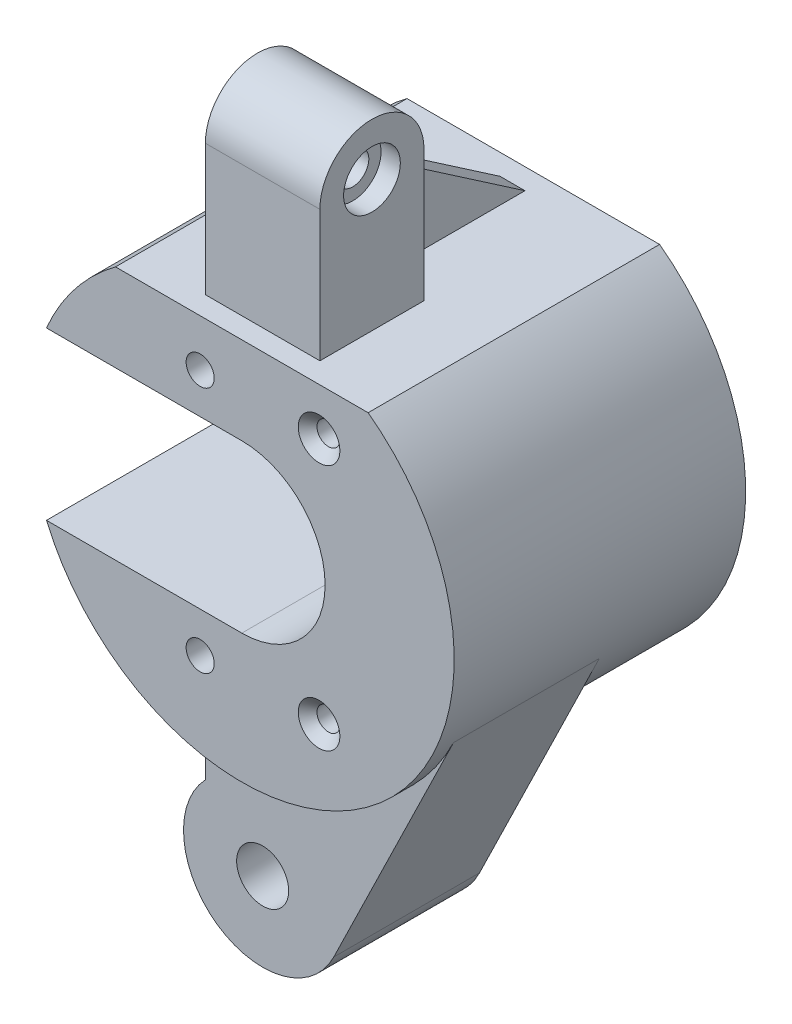
ISO-10303-21;
HEADER;
FILE_DESCRIPTION(('STEP AP214'),'2;1');
FILE_NAME('part.step','',(''),(''),'','','');
FILE_SCHEMA(('AUTOMOTIVE_DESIGN { 1 0 10303 214 1 1 1 1 }'));
ENDSEC;
DATA;
#1=APPLICATION_CONTEXT('core data for automotive mechanical design processes');
#2=APPLICATION_PROTOCOL_DEFINITION('international standard','automotive_design',2000,#1);
#3=PRODUCT_CONTEXT('',#1,'mechanical');
#4=PRODUCT('Part','Part','',(#3));
#5=PRODUCT_RELATED_PRODUCT_CATEGORY('part','',(#4));
#6=PRODUCT_DEFINITION_FORMATION('','',#4);
#7=PRODUCT_DEFINITION_CONTEXT('part definition',#1,'design');
#8=PRODUCT_DEFINITION('design','',#6,#7);
#9=PRODUCT_DEFINITION_SHAPE('','',#8);
#10=(LENGTH_UNIT() NAMED_UNIT(*) SI_UNIT(.MILLI.,.METRE.));
#11=(NAMED_UNIT(*) PLANE_ANGLE_UNIT() SI_UNIT($,.RADIAN.));
#12=(NAMED_UNIT(*) SI_UNIT($,.STERADIAN.) SOLID_ANGLE_UNIT());
#13=UNCERTAINTY_MEASURE_WITH_UNIT(LENGTH_MEASURE(1.E-05),#10,'distance_accuracy_value','');
#14=(GEOMETRIC_REPRESENTATION_CONTEXT(3) GLOBAL_UNCERTAINTY_ASSIGNED_CONTEXT((#13)) GLOBAL_UNIT_ASSIGNED_CONTEXT((#10,
#11,#12)) REPRESENTATION_CONTEXT('',''));
#15=CARTESIAN_POINT('',(0.,0.,0.));
#16=DIRECTION('',(0.,0.,1.));
#17=DIRECTION('',(1.,0.,0.));
#18=AXIS2_PLACEMENT_3D('',#15,#16,#17);
#19=CARTESIAN_POINT('',(0.,0.,-140.));
#20=DIRECTION('',(0.,0.,1.));
#21=DIRECTION('',(1.,0.,0.));
#22=AXIS2_PLACEMENT_3D('',#19,#20,#21);
#23=CYLINDRICAL_SURFACE('',#22,102.);
#24=CARTESIAN_POINT('',(0.,0.,-80.));
#25=DIRECTION('',(0.,0.,-1.));
#26=DIRECTION('',(-1.,0.,0.));
#27=AXIS2_PLACEMENT_3D('',#24,#25,#26);
#28=CIRCLE('',#27,102.);
#29=CARTESIAN_POINT('',(91.6777380623054,-44.7123287671233,-80.));
#30=VERTEX_POINT('',#29);
#31=CARTESIAN_POINT('',(-27.5,-98.2229606558466,-80.));
#32=VERTEX_POINT('',#31);
#33=EDGE_CURVE('E312',#30,#32,#28,.T.);
#34=ORIENTED_EDGE('',*,*,#33,.T.);
#35=DIRECTION('',(0.,0.,1.));
#36=VECTOR('',#35,1.);
#37=CARTESIAN_POINT('',(-27.5,-98.2229606558466,-80.));
#38=LINE('',#37,#36);
#39=CARTESIAN_POINT('',(-27.5,-98.2229606558466,-10.));
#40=VERTEX_POINT('',#39);
#41=EDGE_CURVE('E332',#32,#40,#38,.T.);
#42=ORIENTED_EDGE('',*,*,#41,.T.);
#43=CARTESIAN_POINT('',(0.,0.,-10.));
#44=DIRECTION('',(0.,0.,-1.));
#45=DIRECTION('',(-1.,0.,0.));
#46=AXIS2_PLACEMENT_3D('',#43,#44,#45);
#47=CIRCLE('',#46,102.);
#48=CARTESIAN_POINT('',(91.6777380623054,-44.7123287671233,-10.));
#49=VERTEX_POINT('',#48);
#50=EDGE_CURVE('E313',#49,#40,#47,.T.);
#51=ORIENTED_EDGE('',*,*,#50,.F.);
#52=DIRECTION('',(0.,0.,1.));
#53=VECTOR('',#52,1.);
#54=CARTESIAN_POINT('',(91.6777380623054,-44.7123287671233,-80.));
#55=LINE('',#54,#53);
#56=EDGE_CURVE('E341',#30,#49,#55,.T.);
#57=ORIENTED_EDGE('',*,*,#56,.F.);
#58=EDGE_LOOP('',(#34,#42,#51,#57));
#59=FACE_BOUND('',#58,.T.);
#60=CARTESIAN_POINT('',(0.,0.,-120.));
#61=DIRECTION('',(0.,0.,-1.));
#62=DIRECTION('',(1.,0.,0.));
#63=AXIS2_PLACEMENT_3D('',#60,#61,#62);
#64=CIRCLE('',#63,102.);
#65=CARTESIAN_POINT('',(-88.9044430835715,-50.,-120.));
#66=VERTEX_POINT('',#65);
#67=CARTESIAN_POINT('',(-93.8296328459192,-40.,-120.));
#68=VERTEX_POINT('',#67);
#69=EDGE_CURVE('E227',#66,#68,#64,.T.);
#70=ORIENTED_EDGE('',*,*,#69,.F.);
#71=DIRECTION('',(0.,0.,-1.));
#72=VECTOR('',#71,1.);
#73=CARTESIAN_POINT('',(-88.9044430835715,-50.,-120.));
#74=LINE('',#73,#72);
#75=CARTESIAN_POINT('',(-88.9044430835715,-50.,-140.));
#76=VERTEX_POINT('',#75);
#77=EDGE_CURVE('E208',#66,#76,#74,.T.);
#78=ORIENTED_EDGE('',*,*,#77,.T.);
#79=CARTESIAN_POINT('',(0.,0.,-140.));
#80=DIRECTION('',(0.,0.,1.));
#81=DIRECTION('',(1.,0.,0.));
#82=AXIS2_PLACEMENT_3D('',#79,#80,#81);
#83=CIRCLE('',#82,102.);
#84=CARTESIAN_POINT('',(60.6630035524124,82.,-140.));
#85=VERTEX_POINT('',#84);
#86=EDGE_CURVE('E431',#76,#85,#83,.T.);
#87=ORIENTED_EDGE('',*,*,#86,.T.);
#88=DIRECTION('',(0.,0.,1.));
#89=VECTOR('',#88,1.);
#90=CARTESIAN_POINT('',(60.6630035524124,82.,-140.));
#91=LINE('',#90,#89);
#92=CARTESIAN_POINT('',(60.6630035524124,82.,0.));
#93=VERTEX_POINT('',#92);
#94=EDGE_CURVE('E462',#85,#93,#91,.T.);
#95=ORIENTED_EDGE('',*,*,#94,.T.);
#96=CARTESIAN_POINT('',(0.,0.,0.));
#97=DIRECTION('',(0.,0.,1.));
#98=DIRECTION('',(1.,0.,0.));
#99=AXIS2_PLACEMENT_3D('',#96,#97,#98);
#100=CIRCLE('',#99,102.);
#101=CARTESIAN_POINT('',(-93.8296328459192,-40.,0.));
#102=VERTEX_POINT('',#101);
#103=EDGE_CURVE('E452',#102,#93,#100,.T.);
#104=ORIENTED_EDGE('',*,*,#103,.F.);
#105=DIRECTION('',(0.,0.,1.));
#106=VECTOR('',#105,1.);
#107=CARTESIAN_POINT('',(-93.8296328459192,-40.,-140.));
#108=LINE('',#107,#106);
#109=EDGE_CURVE('E470',#68,#102,#108,.T.);
#110=ORIENTED_EDGE('',*,*,#109,.F.);
#111=EDGE_LOOP('',(#70,#78,#87,#95,#104,#110));
#112=FACE_BOUND('',#111,.T.);
#113=ADVANCED_FACE('F44',(#59,#112),#23,.T.);
#114=CARTESIAN_POINT('',(0.,-40.,-140.));
#115=DIRECTION('',(0.,1.,0.));
#116=DIRECTION('',(0.,0.,1.));
#117=AXIS2_PLACEMENT_3D('',#114,#115,#116);
#118=PLANE('',#117);
#119=DIRECTION('',(0.,0.,1.));
#120=VECTOR('',#119,1.);
#121=CARTESIAN_POINT('',(0.,-40.,-140.));
#122=LINE('',#121,#120);
#123=CARTESIAN_POINT('',(0.,-40.,-120.));
#124=VERTEX_POINT('',#123);
#125=CARTESIAN_POINT('',(0.,-40.,0.));
#126=VERTEX_POINT('',#125);
#127=EDGE_CURVE('E467',#124,#126,#122,.T.);
#128=ORIENTED_EDGE('',*,*,#127,.F.);
#129=DIRECTION('',(-1.,0.,0.));
#130=VECTOR('',#129,1.);
#131=CARTESIAN_POINT('',(0.,-40.,-120.));
#132=LINE('',#131,#130);
#133=EDGE_CURVE('E249',#124,#68,#132,.T.);
#134=ORIENTED_EDGE('',*,*,#133,.T.);
#135=ORIENTED_EDGE('',*,*,#109,.T.);
#136=DIRECTION('',(-1.,0.,0.));
#137=VECTOR('',#136,1.);
#138=CARTESIAN_POINT('',(0.,-40.,0.));
#139=LINE('',#138,#137);
#140=EDGE_CURVE('E453',#126,#102,#139,.T.);
#141=ORIENTED_EDGE('',*,*,#140,.F.);
#142=EDGE_LOOP('',(#128,#134,#135,#141));
#143=FACE_BOUND('',#142,.T.);
#144=ADVANCED_FACE('F538',(#143),#118,.T.);
#145=CARTESIAN_POINT('',(0.,0.,-140.));
#146=DIRECTION('',(0.,0.,1.));
#147=DIRECTION('',(1.,0.,0.));
#148=AXIS2_PLACEMENT_3D('',#145,#146,#147);
#149=CYLINDRICAL_SURFACE('',#148,40.);
#150=DIRECTION('',(0.,0.,1.));
#151=VECTOR('',#150,1.);
#152=CARTESIAN_POINT('',(0.,40.,-140.));
#153=LINE('',#152,#151);
#154=CARTESIAN_POINT('',(0.,40.,-120.));
#155=VERTEX_POINT('',#154);
#156=CARTESIAN_POINT('',(0.,40.,0.));
#157=VERTEX_POINT('',#156);
#158=EDGE_CURVE('E471',#155,#157,#153,.T.);
#159=ORIENTED_EDGE('',*,*,#158,.F.);
#160=CARTESIAN_POINT('',(0.,0.,-120.));
#161=DIRECTION('',(0.,0.,-1.));
#162=DIRECTION('',(-1.,0.,0.));
#163=AXIS2_PLACEMENT_3D('',#160,#161,#162);
#164=CIRCLE('',#163,40.);
#165=EDGE_CURVE('E238',#155,#124,#164,.T.);
#166=ORIENTED_EDGE('',*,*,#165,.T.);
#167=ORIENTED_EDGE('',*,*,#127,.T.);
#168=CARTESIAN_POINT('',(0.,0.,0.));
#169=DIRECTION('',(0.,0.,-1.));
#170=DIRECTION('',(1.,0.,0.));
#171=AXIS2_PLACEMENT_3D('',#168,#169,#170);
#172=CIRCLE('',#171,40.);
#173=EDGE_CURVE('E449',#157,#126,#172,.T.);
#174=ORIENTED_EDGE('',*,*,#173,.F.);
#175=EDGE_LOOP('',(#159,#166,#167,#174));
#176=FACE_BOUND('',#175,.T.);
#177=ADVANCED_FACE('F544',(#176),#149,.F.);
#178=CARTESIAN_POINT('',(0.,40.,-140.));
#179=DIRECTION('',(0.,-1.,0.));
#180=DIRECTION('',(0.,0.,-1.));
#181=AXIS2_PLACEMENT_3D('',#178,#179,#180);
#182=PLANE('',#181);
#183=DIRECTION('',(0.,0.,1.));
#184=VECTOR('',#183,1.);
#185=CARTESIAN_POINT('',(-93.8296328459192,40.,-140.));
#186=LINE('',#185,#184);
#187=CARTESIAN_POINT('',(-93.8296328459192,40.,-120.));
#188=VERTEX_POINT('',#187);
#189=CARTESIAN_POINT('',(-93.8296328459192,40.,0.));
#190=VERTEX_POINT('',#189);
#191=EDGE_CURVE('E438',#188,#190,#186,.T.);
#192=ORIENTED_EDGE('',*,*,#191,.F.);
#193=DIRECTION('',(1.,0.,0.));
#194=VECTOR('',#193,1.);
#195=CARTESIAN_POINT('',(0.,40.,-120.));
#196=LINE('',#195,#194);
#197=EDGE_CURVE('E11',#188,#155,#196,.T.);
#198=ORIENTED_EDGE('',*,*,#197,.T.);
#199=ORIENTED_EDGE('',*,*,#158,.T.);
#200=DIRECTION('',(1.,0.,0.));
#201=VECTOR('',#200,1.);
#202=CARTESIAN_POINT('',(0.,40.,0.));
#203=LINE('',#202,#201);
#204=EDGE_CURVE('E444',#190,#157,#203,.T.);
#205=ORIENTED_EDGE('',*,*,#204,.F.);
#206=EDGE_LOOP('',(#192,#198,#199,#205));
#207=FACE_BOUND('',#206,.T.);
#208=ADVANCED_FACE('F554',(#207),#182,.T.);
#209=CARTESIAN_POINT('',(0.,0.,-140.));
#210=DIRECTION('',(0.,0.,1.));
#211=DIRECTION('',(1.,0.,0.));
#212=AXIS2_PLACEMENT_3D('',#209,#210,#211);
#213=PLANE('',#212);
#214=CARTESIAN_POINT('',(37.0943484963242,-59.3633667309499,-140.));
#215=DIRECTION('',(0.,0.,1.));
#216=DIRECTION('',(1.,0.,0.));
#217=AXIS2_PLACEMENT_3D('',#214,#215,#216);
#218=CIRCLE('',#217,5.49999999999998);
#219=CARTESIAN_POINT('',(42.5943484963242,-59.3633667309499,-140.));
#220=VERTEX_POINT('',#219);
#221=EDGE_CURVE('E305',#220,#220,#218,.T.);
#222=ORIENTED_EDGE('',*,*,#221,.T.);
#223=EDGE_LOOP('',(#222));
#224=FACE_BOUND('',#223,.T.);
#225=CARTESIAN_POINT('',(37.0943484963242,59.3633667309499,-140.));
#226=DIRECTION('',(0.,0.,1.));
#227=DIRECTION('',(1.,0.,0.));
#228=AXIS2_PLACEMENT_3D('',#225,#226,#227);
#229=CIRCLE('',#228,5.49999999999998);
#230=CARTESIAN_POINT('',(42.5943484963242,59.3633667309499,-140.));
#231=VERTEX_POINT('',#230);
#232=EDGE_CURVE('E287',#231,#231,#229,.T.);
#233=ORIENTED_EDGE('',*,*,#232,.T.);
#234=EDGE_LOOP('',(#233));
#235=FACE_BOUND('',#234,.T.);
#236=DIRECTION('',(-1.,0.,0.));
#237=VECTOR('',#236,1.);
#238=CARTESIAN_POINT('',(0.,-50.,-140.));
#239=LINE('',#238,#237);
#240=CARTESIAN_POINT('',(0.,-50.,-140.));
#241=VERTEX_POINT('',#240);
#242=EDGE_CURVE('E223',#241,#76,#239,.T.);
#243=ORIENTED_EDGE('',*,*,#242,.F.);
#244=CARTESIAN_POINT('',(0.,0.,-140.));
#245=DIRECTION('',(0.,0.,-1.));
#246=DIRECTION('',(-1.,0.,0.));
#247=AXIS2_PLACEMENT_3D('',#244,#245,#246);
#248=CIRCLE('',#247,50.);
#249=CARTESIAN_POINT('',(0.,50.,-140.));
#250=VERTEX_POINT('',#249);
#251=EDGE_CURVE('E204',#250,#241,#248,.T.);
#252=ORIENTED_EDGE('',*,*,#251,.F.);
#253=DIRECTION('',(1.,0.,0.));
#254=VECTOR('',#253,1.);
#255=CARTESIAN_POINT('',(0.,50.,-140.));
#256=LINE('',#255,#254);
#257=CARTESIAN_POINT('',(-88.9044430835715,50.,-140.));
#258=VERTEX_POINT('',#257);
#259=EDGE_CURVE('E63',#258,#250,#256,.T.);
#260=ORIENTED_EDGE('',*,*,#259,.F.);
#261=CARTESIAN_POINT('',(0.,0.,-140.));
#262=DIRECTION('',(0.,0.,1.));
#263=DIRECTION('',(1.,0.,0.));
#264=AXIS2_PLACEMENT_3D('',#261,#262,#263);
#265=CIRCLE('',#264,102.);
#266=CARTESIAN_POINT('',(-60.6630035524124,82.,-140.));
#267=VERTEX_POINT('',#266);
#268=EDGE_CURVE('E430',#267,#258,#265,.T.);
#269=ORIENTED_EDGE('',*,*,#268,.F.);
#270=DIRECTION('',(-1.,0.,0.));
#271=VECTOR('',#270,1.);
#272=CARTESIAN_POINT('',(-60.6630035524124,82.,-140.));
#273=LINE('',#272,#271);
#274=EDGE_CURVE('E434',#85,#267,#273,.T.);
#275=ORIENTED_EDGE('',*,*,#274,.F.);
#276=ORIENTED_EDGE('',*,*,#86,.F.);
#277=EDGE_LOOP('',(#243,#252,#260,#269,#275,#276));
#278=FACE_BOUND('',#277,.T.);
#279=ADVANCED_FACE('F488',(#224,#235,#278),#213,.F.);
#280=CARTESIAN_POINT('',(-27.5,7.66965626340746,-9.99999999999999));
#281=DIRECTION('',(-1.,0.,0.));
#282=DIRECTION('',(0.,0.,1.));
#283=AXIS2_PLACEMENT_3D('',#280,#281,#282);
#284=PLANE('',#283);
#285=CARTESIAN_POINT('',(-27.5,145.,-35.));
#286=DIRECTION('',(-1.,0.,0.));
#287=DIRECTION('',(0.,0.,1.));
#288=AXIS2_PLACEMENT_3D('',#285,#286,#287);
#289=CIRCLE('',#288,7.74999999999998);
#290=CARTESIAN_POINT('',(-27.5,145.,-27.25));
#291=VERTEX_POINT('',#290);
#292=EDGE_CURVE('E264',#291,#291,#289,.T.);
#293=ORIENTED_EDGE('',*,*,#292,.F.);
#294=EDGE_LOOP('',(#293));
#295=FACE_BOUND('',#294,.T.);
#296=DIRECTION('',(0.,1.,0.));
#297=VECTOR('',#296,1.);
#298=CARTESIAN_POINT('',(-27.5,7.66965626340746,-9.99999999999999));
#299=LINE('',#298,#297);
#300=CARTESIAN_POINT('',(-27.5,82.,-10.));
#301=VERTEX_POINT('',#300);
#302=CARTESIAN_POINT('',(-27.5,145.,-9.99999999999999));
#303=VERTEX_POINT('',#302);
#304=EDGE_CURVE('E398',#301,#303,#299,.T.);
#305=ORIENTED_EDGE('',*,*,#304,.T.);
#306=CARTESIAN_POINT('',(-27.5,145.,-35.));
#307=DIRECTION('',(-1.,0.,0.));
#308=DIRECTION('',(0.,0.,1.));
#309=AXIS2_PLACEMENT_3D('',#306,#307,#308);
#310=CIRCLE('',#309,25.);
#311=CARTESIAN_POINT('',(-27.5,145.,-60.));
#312=VERTEX_POINT('',#311);
#313=EDGE_CURVE('E382',#303,#312,#310,.T.);
#314=ORIENTED_EDGE('',*,*,#313,.T.);
#315=DIRECTION('',(0.,1.,0.));
#316=VECTOR('',#315,1.);
#317=CARTESIAN_POINT('',(-27.5,7.66965626340746,-60.));
#318=LINE('',#317,#316);
#319=CARTESIAN_POINT('',(-27.5,82.,-60.));
#320=VERTEX_POINT('',#319);
#321=EDGE_CURVE('E402',#320,#312,#318,.T.);
#322=ORIENTED_EDGE('',*,*,#321,.F.);
#323=DIRECTION('',(0.,0.,-1.));
#324=VECTOR('',#323,1.);
#325=CARTESIAN_POINT('',(-27.5,82.,-9.99999999999999));
#326=LINE('',#325,#324);
#327=EDGE_CURVE('E408',#301,#320,#326,.T.);
#328=ORIENTED_EDGE('',*,*,#327,.F.);
#329=EDGE_LOOP('',(#305,#314,#322,#328));
#330=FACE_BOUND('',#329,.T.);
#331=ADVANCED_FACE('F482',(#295,#330),#284,.T.);
#332=CARTESIAN_POINT('',(27.5,7.66965626340746,-9.99999999999999));
#333=DIRECTION('',(1.,0.,0.));
#334=DIRECTION('',(0.,0.,-1.));
#335=AXIS2_PLACEMENT_3D('',#332,#333,#334);
#336=PLANE('',#335);
#337=CARTESIAN_POINT('',(27.5,145.,-35.));
#338=DIRECTION('',(1.,0.,0.));
#339=DIRECTION('',(0.,0.,-1.));
#340=AXIS2_PLACEMENT_3D('',#337,#338,#339);
#341=CIRCLE('',#340,13.625);
#342=CARTESIAN_POINT('',(27.5,145.,-48.625));
#343=VERTEX_POINT('',#342);
#344=EDGE_CURVE('E251',#343,#343,#341,.T.);
#345=ORIENTED_EDGE('',*,*,#344,.F.);
#346=EDGE_LOOP('',(#345));
#347=FACE_BOUND('',#346,.T.);
#348=CARTESIAN_POINT('',(27.5,145.,-35.));
#349=DIRECTION('',(1.,0.,0.));
#350=DIRECTION('',(0.,0.,-1.));
#351=AXIS2_PLACEMENT_3D('',#348,#349,#350);
#352=CIRCLE('',#351,25.);
#353=CARTESIAN_POINT('',(27.5,145.,-60.));
#354=VERTEX_POINT('',#353);
#355=CARTESIAN_POINT('',(27.5,145.,-9.99999999999999));
#356=VERTEX_POINT('',#355);
#357=EDGE_CURVE('E392',#354,#356,#352,.T.);
#358=ORIENTED_EDGE('',*,*,#357,.T.);
#359=DIRECTION('',(0.,1.,0.));
#360=VECTOR('',#359,1.);
#361=CARTESIAN_POINT('',(27.5,7.66965626340746,-9.99999999999999));
#362=LINE('',#361,#360);
#363=CARTESIAN_POINT('',(27.5,82.,-9.99999999999999));
#364=VERTEX_POINT('',#363);
#365=EDGE_CURVE('E417',#364,#356,#362,.T.);
#366=ORIENTED_EDGE('',*,*,#365,.F.);
#367=DIRECTION('',(0.,0.,1.));
#368=VECTOR('',#367,1.);
#369=CARTESIAN_POINT('',(27.5,82.,-9.99999999999999));
#370=LINE('',#369,#368);
#371=CARTESIAN_POINT('',(27.5,82.,-60.));
#372=VERTEX_POINT('',#371);
#373=EDGE_CURVE('E400',#372,#364,#370,.T.);
#374=ORIENTED_EDGE('',*,*,#373,.F.);
#375=DIRECTION('',(0.,1.,0.));
#376=VECTOR('',#375,1.);
#377=CARTESIAN_POINT('',(27.5,7.66965626340746,-60.));
#378=LINE('',#377,#376);
#379=EDGE_CURVE('E411',#372,#354,#378,.T.);
#380=ORIENTED_EDGE('',*,*,#379,.T.);
#381=EDGE_LOOP('',(#358,#366,#374,#380));
#382=FACE_BOUND('',#381,.T.);
#383=ADVANCED_FACE('F490',(#347,#382),#336,.T.);
#384=CARTESIAN_POINT('',(27.5,7.66965626340746,-9.99999999999999));
#385=DIRECTION('',(0.,0.,1.));
#386=DIRECTION('',(1.,0.,0.));
#387=AXIS2_PLACEMENT_3D('',#384,#385,#386);
#388=PLANE('',#387);
#389=DIRECTION('',(-1.,0.,0.));
#390=VECTOR('',#389,1.);
#391=CARTESIAN_POINT('',(102.,145.,-9.99999999999999));
#392=LINE('',#391,#390);
#393=EDGE_CURVE('E53',#356,#303,#392,.T.);
#394=ORIENTED_EDGE('',*,*,#393,.T.);
#395=ORIENTED_EDGE('',*,*,#304,.F.);
#396=DIRECTION('',(-1.,0.,0.));
#397=VECTOR('',#396,1.);
#398=CARTESIAN_POINT('',(27.5,82.,-9.99999999999999));
#399=LINE('',#398,#397);
#400=EDGE_CURVE('E410',#364,#301,#399,.T.);
#401=ORIENTED_EDGE('',*,*,#400,.F.);
#402=ORIENTED_EDGE('',*,*,#365,.T.);
#403=EDGE_LOOP('',(#394,#395,#401,#402));
#404=FACE_BOUND('',#403,.T.);
#405=ADVANCED_FACE('F497',(#404),#388,.T.);
#406=CARTESIAN_POINT('',(0.,0.,-140.));
#407=DIRECTION('',(0.,0.,1.));
#408=DIRECTION('',(1.,0.,0.));
#409=AXIS2_PLACEMENT_3D('',#406,#407,#408);
#410=CYLINDRICAL_SURFACE('',#409,102.);
#411=CARTESIAN_POINT('',(-88.9044430835715,50.,-120.));
#412=VERTEX_POINT('',#411);
#413=EDGE_CURVE('E217',#188,#412,#64,.T.);
#414=ORIENTED_EDGE('',*,*,#413,.F.);
#415=ORIENTED_EDGE('',*,*,#191,.T.);
#416=CARTESIAN_POINT('',(0.,0.,0.));
#417=DIRECTION('',(0.,0.,1.));
#418=DIRECTION('',(1.,0.,0.));
#419=AXIS2_PLACEMENT_3D('',#416,#417,#418);
#420=CIRCLE('',#419,102.);
#421=CARTESIAN_POINT('',(-60.6630035524124,82.,0.));
#422=VERTEX_POINT('',#421);
#423=EDGE_CURVE('E426',#422,#190,#420,.T.);
#424=ORIENTED_EDGE('',*,*,#423,.F.);
#425=DIRECTION('',(0.,0.,1.));
#426=VECTOR('',#425,1.);
#427=CARTESIAN_POINT('',(-60.6630035524124,82.,-140.));
#428=LINE('',#427,#426);
#429=EDGE_CURVE('E387',#267,#422,#428,.T.);
#430=ORIENTED_EDGE('',*,*,#429,.F.);
#431=ORIENTED_EDGE('',*,*,#268,.T.);
#432=DIRECTION('',(0.,0.,-1.));
#433=VECTOR('',#432,1.);
#434=CARTESIAN_POINT('',(-88.9044430835715,50.,-120.));
#435=LINE('',#434,#433);
#436=EDGE_CURVE('E243',#412,#258,#435,.T.);
#437=ORIENTED_EDGE('',*,*,#436,.F.);
#438=EDGE_LOOP('',(#414,#415,#424,#430,#431,#437));
#439=FACE_BOUND('',#438,.T.);
#440=ADVANCED_FACE('F50',(#439),#410,.T.);
#441=CARTESIAN_POINT('',(-60.6630035524124,82.,-140.));
#442=DIRECTION('',(0.,1.,0.));
#443=DIRECTION('',(0.,0.,1.));
#444=AXIS2_PLACEMENT_3D('',#441,#442,#443);
#445=PLANE('',#444);
#446=ORIENTED_EDGE('',*,*,#400,.T.);
#447=ORIENTED_EDGE('',*,*,#327,.T.);
#448=DIRECTION('',(1.,0.,0.));
#449=VECTOR('',#448,1.);
#450=CARTESIAN_POINT('',(27.5,82.,-60.));
#451=LINE('',#450,#449);
#452=CARTESIAN_POINT('',(-6.,82.,-60.));
#453=VERTEX_POINT('',#452);
#454=EDGE_CURVE('E405',#320,#453,#451,.T.);
#455=ORIENTED_EDGE('',*,*,#454,.T.);
#456=DIRECTION('',(0.,0.,-1.));
#457=VECTOR('',#456,1.);
#458=CARTESIAN_POINT('',(-6.,82.,-140.));
#459=LINE('',#458,#457);
#460=CARTESIAN_POINT('',(-6.,82.,-130.));
#461=VERTEX_POINT('',#460);
#462=EDGE_CURVE('E365',#453,#461,#459,.T.);
#463=ORIENTED_EDGE('',*,*,#462,.T.);
#464=DIRECTION('',(1.,0.,0.));
#465=VECTOR('',#464,1.);
#466=CARTESIAN_POINT('',(-60.6630035524124,82.,-130.));
#467=LINE('',#466,#465);
#468=CARTESIAN_POINT('',(6.,82.,-130.));
#469=VERTEX_POINT('',#468);
#470=EDGE_CURVE('E379',#469,#461,#467,.F.);
#471=ORIENTED_EDGE('',*,*,#470,.F.);
#472=DIRECTION('',(0.,0.,-1.));
#473=VECTOR('',#472,1.);
#474=CARTESIAN_POINT('',(6.00000000000001,82.,-140.));
#475=LINE('',#474,#473);
#476=CARTESIAN_POINT('',(6.,82.,-60.));
#477=VERTEX_POINT('',#476);
#478=EDGE_CURVE('E375',#477,#469,#475,.T.);
#479=ORIENTED_EDGE('',*,*,#478,.F.);
#480=EDGE_CURVE('E397',#477,#372,#451,.T.);
#481=ORIENTED_EDGE('',*,*,#480,.T.);
#482=ORIENTED_EDGE('',*,*,#373,.T.);
#483=EDGE_LOOP('',(#446,#447,#455,#463,#471,#479,#481,#482));
#484=FACE_BOUND('',#483,.T.);
#485=ORIENTED_EDGE('',*,*,#429,.T.);
#486=DIRECTION('',(-1.,0.,0.));
#487=VECTOR('',#486,1.);
#488=CARTESIAN_POINT('',(-60.6630035524124,82.,0.));
#489=LINE('',#488,#487);
#490=EDGE_CURVE('E435',#93,#422,#489,.T.);
#491=ORIENTED_EDGE('',*,*,#490,.F.);
#492=ORIENTED_EDGE('',*,*,#94,.F.);
#493=ORIENTED_EDGE('',*,*,#274,.T.);
#494=EDGE_LOOP('',(#485,#491,#492,#493));
#495=FACE_BOUND('',#494,.T.);
#496=ADVANCED_FACE('F512',(#484,#495),#445,.T.);
#497=CARTESIAN_POINT('',(0.,0.,0.));
#498=DIRECTION('',(0.,0.,1.));
#499=DIRECTION('',(1.,0.,0.));
#500=AXIS2_PLACEMENT_3D('',#497,#498,#499);
#501=PLANE('',#500);
#502=CARTESIAN_POINT('',(-20.,-59.3633667309499,0.));
#503=DIRECTION('',(0.,0.,1.));
#504=DIRECTION('',(1.,0.,0.));
#505=AXIS2_PLACEMENT_3D('',#502,#503,#504);
#506=CIRCLE('',#505,6.74999999999999);
#507=CARTESIAN_POINT('',(-13.25,-59.3633667309499,0.));
#508=VERTEX_POINT('',#507);
#509=EDGE_CURVE('E266',#508,#508,#506,.T.);
#510=ORIENTED_EDGE('',*,*,#509,.F.);
#511=EDGE_LOOP('',(#510));
#512=FACE_BOUND('',#511,.T.);
#513=CARTESIAN_POINT('',(-20.,59.3633667309499,0.));
#514=DIRECTION('',(0.,0.,1.));
#515=DIRECTION('',(1.,0.,0.));
#516=AXIS2_PLACEMENT_3D('',#513,#514,#515);
#517=CIRCLE('',#516,6.74999999999999);
#518=CARTESIAN_POINT('',(-13.25,59.3633667309499,0.));
#519=VERTEX_POINT('',#518);
#520=EDGE_CURVE('E273',#519,#519,#517,.T.);
#521=ORIENTED_EDGE('',*,*,#520,.F.);
#522=EDGE_LOOP('',(#521));
#523=FACE_BOUND('',#522,.T.);
#524=CARTESIAN_POINT('',(37.0943484963242,59.3633667309499,0.));
#525=DIRECTION('',(0.,0.,1.));
#526=DIRECTION('',(1.,0.,0.));
#527=AXIS2_PLACEMENT_3D('',#524,#525,#526);
#528=CIRCLE('',#527,10.);
#529=CARTESIAN_POINT('',(47.0943484963242,59.3633667309499,0.));
#530=VERTEX_POINT('',#529);
#531=EDGE_CURVE('E284',#530,#530,#528,.T.);
#532=ORIENTED_EDGE('',*,*,#531,.F.);
#533=EDGE_LOOP('',(#532));
#534=FACE_BOUND('',#533,.T.);
#535=CARTESIAN_POINT('',(37.0943484963242,-59.3633667309499,0.));
#536=DIRECTION('',(0.,0.,1.));
#537=DIRECTION('',(1.,0.,0.));
#538=AXIS2_PLACEMENT_3D('',#535,#536,#537);
#539=CIRCLE('',#538,10.);
#540=CARTESIAN_POINT('',(47.0943484963242,-59.3633667309499,0.));
#541=VERTEX_POINT('',#540);
#542=EDGE_CURVE('E294',#541,#541,#539,.T.);
#543=ORIENTED_EDGE('',*,*,#542,.F.);
#544=EDGE_LOOP('',(#543));
#545=FACE_BOUND('',#544,.T.);
#546=ORIENTED_EDGE('',*,*,#173,.T.);
#547=ORIENTED_EDGE('',*,*,#140,.T.);
#548=ORIENTED_EDGE('',*,*,#103,.T.);
#549=ORIENTED_EDGE('',*,*,#490,.T.);
#550=ORIENTED_EDGE('',*,*,#423,.T.);
#551=ORIENTED_EDGE('',*,*,#204,.T.);
#552=EDGE_LOOP('',(#546,#547,#548,#549,#550,#551));
#553=FACE_BOUND('',#552,.T.);
#554=ADVANCED_FACE('F582',(#512,#523,#534,#545,#553),#501,.T.);
#555=CARTESIAN_POINT('',(27.5,7.66965626340746,-60.));
#556=DIRECTION('',(0.,0.,-1.));
#557=DIRECTION('',(-1.,0.,0.));
#558=AXIS2_PLACEMENT_3D('',#555,#556,#557);
#559=PLANE('',#558);
#560=DIRECTION('',(0.,-1.,0.));
#561=VECTOR('',#560,1.);
#562=CARTESIAN_POINT('',(6.,7.66965626340746,-60.));
#563=LINE('',#562,#561);
#564=CARTESIAN_POINT('',(6.,130.,-60.));
#565=VERTEX_POINT('',#564);
#566=EDGE_CURVE('E366',#565,#477,#563,.T.);
#567=ORIENTED_EDGE('',*,*,#566,.F.);
#568=DIRECTION('',(-1.,0.,0.));
#569=VECTOR('',#568,1.);
#570=CARTESIAN_POINT('',(27.5,130.,-60.));
#571=LINE('',#570,#569);
#572=CARTESIAN_POINT('',(-6.,130.,-60.));
#573=VERTEX_POINT('',#572);
#574=EDGE_CURVE('E374',#573,#565,#571,.F.);
#575=ORIENTED_EDGE('',*,*,#574,.F.);
#576=DIRECTION('',(0.,-1.,0.));
#577=VECTOR('',#576,1.);
#578=CARTESIAN_POINT('',(-6.,7.66965626340746,-60.));
#579=LINE('',#578,#577);
#580=EDGE_CURVE('E357',#573,#453,#579,.T.);
#581=ORIENTED_EDGE('',*,*,#580,.T.);
#582=ORIENTED_EDGE('',*,*,#454,.F.);
#583=ORIENTED_EDGE('',*,*,#321,.T.);
#584=DIRECTION('',(-1.,0.,0.));
#585=VECTOR('',#584,1.);
#586=CARTESIAN_POINT('',(102.,145.,-60.));
#587=LINE('',#586,#585);
#588=EDGE_CURVE('E388',#354,#312,#587,.T.);
#589=ORIENTED_EDGE('',*,*,#588,.F.);
#590=ORIENTED_EDGE('',*,*,#379,.F.);
#591=ORIENTED_EDGE('',*,*,#480,.F.);
#592=EDGE_LOOP('',(#567,#575,#581,#582,#583,#589,#590,#591));
#593=FACE_BOUND('',#592,.T.);
#594=ADVANCED_FACE('F501',(#593),#559,.T.);
#595=CARTESIAN_POINT('',(102.,145.,-35.));
#596=DIRECTION('',(-1.,0.,0.));
#597=DIRECTION('',(0.,0.,1.));
#598=AXIS2_PLACEMENT_3D('',#595,#596,#597);
#599=CYLINDRICAL_SURFACE('',#598,25.);
#600=ORIENTED_EDGE('',*,*,#313,.F.);
#601=ORIENTED_EDGE('',*,*,#393,.F.);
#602=ORIENTED_EDGE('',*,*,#357,.F.);
#603=ORIENTED_EDGE('',*,*,#588,.T.);
#604=EDGE_LOOP('',(#600,#601,#602,#603));
#605=FACE_BOUND('',#604,.T.);
#606=ADVANCED_FACE('F498',(#605),#599,.T.);
#607=CARTESIAN_POINT('',(0.,130.,-60.));
#608=DIRECTION('',(0.,-0.824728851845978,0.565528355551528));
#609=DIRECTION('',(0.,-0.565528355551528,-0.824728851845978));
#610=AXIS2_PLACEMENT_3D('',#607,#608,#609);
#611=PLANE('',#610);
#612=DIRECTION('',(0.,-0.565528355551528,-0.824728851845978));
#613=VECTOR('',#612,1.);
#614=CARTESIAN_POINT('',(6.,130.,-60.));
#615=LINE('',#614,#613);
#616=EDGE_CURVE('E358',#565,#469,#615,.T.);
#617=ORIENTED_EDGE('',*,*,#616,.T.);
#618=ORIENTED_EDGE('',*,*,#470,.T.);
#619=DIRECTION('',(0.,-0.565528355551528,-0.824728851845978));
#620=VECTOR('',#619,1.);
#621=CARTESIAN_POINT('',(-6.,130.,-60.));
#622=LINE('',#621,#620);
#623=EDGE_CURVE('E347',#573,#461,#622,.T.);
#624=ORIENTED_EDGE('',*,*,#623,.F.);
#625=ORIENTED_EDGE('',*,*,#574,.T.);
#626=EDGE_LOOP('',(#617,#618,#624,#625));
#627=FACE_BOUND('',#626,.T.);
#628=ADVANCED_FACE('F523',(#627),#611,.F.);
#629=CARTESIAN_POINT('',(6.,34.,-70.));
#630=DIRECTION('',(1.,0.,0.));
#631=DIRECTION('',(0.,0.,-1.));
#632=AXIS2_PLACEMENT_3D('',#629,#630,#631);
#633=PLANE('',#632);
#634=ORIENTED_EDGE('',*,*,#566,.T.);
#635=ORIENTED_EDGE('',*,*,#478,.T.);
#636=ORIENTED_EDGE('',*,*,#616,.F.);
#637=EDGE_LOOP('',(#634,#635,#636));
#638=FACE_BOUND('',#637,.T.);
#639=ADVANCED_FACE('F520',(#638),#633,.T.);
#640=CARTESIAN_POINT('',(-6.,34.,-70.));
#641=DIRECTION('',(1.,0.,0.));
#642=DIRECTION('',(0.,0.,-1.));
#643=AXIS2_PLACEMENT_3D('',#640,#641,#642);
#644=PLANE('',#643);
#645=ORIENTED_EDGE('',*,*,#462,.F.);
#646=ORIENTED_EDGE('',*,*,#580,.F.);
#647=ORIENTED_EDGE('',*,*,#623,.T.);
#648=EDGE_LOOP('',(#645,#646,#647));
#649=FACE_BOUND('',#648,.T.);
#650=ADVANCED_FACE('F524',(#649),#644,.F.);
#651=CARTESIAN_POINT('',(34.1544514349765,-162.657534246575,-80.));
#652=DIRECTION('',(0.898801353552014,-0.438356164383562,0.));
#653=DIRECTION('',(0.438356164383562,0.898801353552014,0.));
#654=AXIS2_PLACEMENT_3D('',#651,#652,#653);
#655=PLANE('',#654);
#656=DIRECTION('',(0.438356164383562,0.898801353552014,0.));
#657=VECTOR('',#656,1.);
#658=CARTESIAN_POINT('',(34.1544514349765,-162.657534246575,-10.));
#659=LINE('',#658,#657);
#660=CARTESIAN_POINT('',(34.1544514349765,-162.657534246575,-10.));
#661=VERTEX_POINT('',#660);
#662=EDGE_CURVE('E69',#661,#49,#659,.T.);
#663=ORIENTED_EDGE('',*,*,#662,.F.);
#664=DIRECTION('',(0.,0.,1.));
#665=VECTOR('',#664,1.);
#666=CARTESIAN_POINT('',(34.1544514349765,-162.657534246575,-80.));
#667=LINE('',#666,#665);
#668=CARTESIAN_POINT('',(34.1544514349765,-162.657534246575,-80.));
#669=VERTEX_POINT('',#668);
#670=EDGE_CURVE('E350',#669,#661,#667,.T.);
#671=ORIENTED_EDGE('',*,*,#670,.F.);
#672=DIRECTION('',(0.438356164383562,0.898801353552014,0.));
#673=VECTOR('',#672,1.);
#674=CARTESIAN_POINT('',(34.1544514349765,-162.657534246575,-80.));
#675=LINE('',#674,#673);
#676=EDGE_CURVE('E330',#669,#30,#675,.T.);
#677=ORIENTED_EDGE('',*,*,#676,.T.);
#678=ORIENTED_EDGE('',*,*,#56,.T.);
#679=EDGE_LOOP('',(#663,#671,#677,#678));
#680=FACE_BOUND('',#679,.T.);
#681=ADVANCED_FACE('F528',(#680),#655,.T.);
#682=CARTESIAN_POINT('',(0.,-146.,-80.));
#683=DIRECTION('',(0.,0.,1.));
#684=DIRECTION('',(1.,0.,0.));
#685=AXIS2_PLACEMENT_3D('',#682,#683,#684);
#686=CYLINDRICAL_SURFACE('',#685,38.);
#687=CARTESIAN_POINT('',(0.,-146.,-10.));
#688=DIRECTION('',(0.,0.,1.));
#689=DIRECTION('',(1.,0.,0.));
#690=AXIS2_PLACEMENT_3D('',#687,#688,#689);
#691=CIRCLE('',#690,38.);
#692=CARTESIAN_POINT('',(-27.5,-119.775011916113,-10.));
#693=VERTEX_POINT('',#692);
#694=EDGE_CURVE('E337',#693,#661,#691,.T.);
#695=ORIENTED_EDGE('',*,*,#694,.F.);
#696=DIRECTION('',(0.,0.,1.));
#697=VECTOR('',#696,1.);
#698=CARTESIAN_POINT('',(-27.5,-119.775011916113,-80.));
#699=LINE('',#698,#697);
#700=CARTESIAN_POINT('',(-27.5,-119.775011916113,-80.));
#701=VERTEX_POINT('',#700);
#702=EDGE_CURVE('E348',#701,#693,#699,.T.);
#703=ORIENTED_EDGE('',*,*,#702,.F.);
#704=CARTESIAN_POINT('',(0.,-146.,-80.));
#705=DIRECTION('',(0.,0.,1.));
#706=DIRECTION('',(1.,0.,0.));
#707=AXIS2_PLACEMENT_3D('',#704,#705,#706);
#708=CIRCLE('',#707,38.);
#709=EDGE_CURVE('E323',#701,#669,#708,.T.);
#710=ORIENTED_EDGE('',*,*,#709,.T.);
#711=ORIENTED_EDGE('',*,*,#670,.T.);
#712=EDGE_LOOP('',(#695,#703,#710,#711));
#713=FACE_BOUND('',#712,.T.);
#714=ADVANCED_FACE('F535',(#713),#686,.T.);
#715=CARTESIAN_POINT('',(-27.5,-98.2229606558466,-80.));
#716=DIRECTION('',(-1.,0.,0.));
#717=DIRECTION('',(0.,0.,1.));
#718=AXIS2_PLACEMENT_3D('',#715,#716,#717);
#719=PLANE('',#718);
#720=DIRECTION('',(0.,-1.,0.));
#721=VECTOR('',#720,1.);
#722=CARTESIAN_POINT('',(-27.5,-98.2229606558466,-10.));
#723=LINE('',#722,#721);
#724=EDGE_CURVE('E331',#40,#693,#723,.T.);
#725=ORIENTED_EDGE('',*,*,#724,.F.);
#726=ORIENTED_EDGE('',*,*,#41,.F.);
#727=DIRECTION('',(0.,-1.,0.));
#728=VECTOR('',#727,1.);
#729=CARTESIAN_POINT('',(-27.5,-98.2229606558466,-80.));
#730=LINE('',#729,#728);
#731=EDGE_CURVE('E317',#32,#701,#730,.T.);
#732=ORIENTED_EDGE('',*,*,#731,.T.);
#733=ORIENTED_EDGE('',*,*,#702,.T.);
#734=EDGE_LOOP('',(#725,#726,#732,#733));
#735=FACE_BOUND('',#734,.T.);
#736=ADVANCED_FACE('F634',(#735),#719,.T.);
#737=CARTESIAN_POINT('',(0.,0.,-80.));
#738=DIRECTION('',(0.,0.,-1.));
#739=DIRECTION('',(-1.,0.,0.));
#740=AXIS2_PLACEMENT_3D('',#737,#738,#739);
#741=PLANE('',#740);
#742=CARTESIAN_POINT('',(0.,-146.,-80.));
#743=DIRECTION('',(0.,0.,1.));
#744=DIRECTION('',(1.,0.,0.));
#745=AXIS2_PLACEMENT_3D('',#742,#743,#744);
#746=CIRCLE('',#745,12.5);
#747=CARTESIAN_POINT('',(12.5,-146.,-80.));
#748=VERTEX_POINT('',#747);
#749=EDGE_CURVE('E307',#748,#748,#746,.T.);
#750=ORIENTED_EDGE('',*,*,#749,.T.);
#751=EDGE_LOOP('',(#750));
#752=FACE_BOUND('',#751,.T.);
#753=ORIENTED_EDGE('',*,*,#33,.F.);
#754=ORIENTED_EDGE('',*,*,#676,.F.);
#755=ORIENTED_EDGE('',*,*,#709,.F.);
#756=ORIENTED_EDGE('',*,*,#731,.F.);
#757=EDGE_LOOP('',(#753,#754,#755,#756));
#758=FACE_BOUND('',#757,.T.);
#759=ADVANCED_FACE('F644',(#752,#758),#741,.T.);
#760=CARTESIAN_POINT('',(0.,0.,-10.));
#761=DIRECTION('',(0.,0.,-1.));
#762=DIRECTION('',(-1.,0.,0.));
#763=AXIS2_PLACEMENT_3D('',#760,#761,#762);
#764=PLANE('',#763);
#765=CARTESIAN_POINT('',(0.,-146.,-10.));
#766=DIRECTION('',(0.,0.,1.));
#767=DIRECTION('',(1.,0.,0.));
#768=AXIS2_PLACEMENT_3D('',#765,#766,#767);
#769=CIRCLE('',#768,12.5);
#770=CARTESIAN_POINT('',(12.5,-146.,-10.));
#771=VERTEX_POINT('',#770);
#772=EDGE_CURVE('E308',#771,#771,#769,.T.);
#773=ORIENTED_EDGE('',*,*,#772,.F.);
#774=EDGE_LOOP('',(#773));
#775=FACE_BOUND('',#774,.T.);
#776=ORIENTED_EDGE('',*,*,#50,.T.);
#777=ORIENTED_EDGE('',*,*,#724,.T.);
#778=ORIENTED_EDGE('',*,*,#694,.T.);
#779=ORIENTED_EDGE('',*,*,#662,.T.);
#780=EDGE_LOOP('',(#776,#777,#778,#779));
#781=FACE_BOUND('',#780,.T.);
#782=ADVANCED_FACE('F652',(#775,#781),#764,.F.);
#783=CARTESIAN_POINT('',(0.,-146.,-80.));
#784=DIRECTION('',(0.,0.,1.));
#785=DIRECTION('',(1.,0.,0.));
#786=AXIS2_PLACEMENT_3D('',#783,#784,#785);
#787=CYLINDRICAL_SURFACE('',#786,12.5);
#788=ORIENTED_EDGE('',*,*,#749,.F.);
#789=EDGE_LOOP('',(#788));
#790=FACE_BOUND('',#789,.T.);
#791=ORIENTED_EDGE('',*,*,#772,.T.);
#792=EDGE_LOOP('',(#791));
#793=FACE_BOUND('',#792,.T.);
#794=ADVANCED_FACE('F661',(#790,#793),#787,.F.);
#795=CARTESIAN_POINT('',(37.0943484963242,-59.3633667309499,0.));
#796=DIRECTION('',(0.,0.,1.));
#797=DIRECTION('',(1.,0.,0.));
#798=AXIS2_PLACEMENT_3D('',#795,#796,#797);
#799=CYLINDRICAL_SURFACE('',#798,5.49999999999999);
#800=ORIENTED_EDGE('',*,*,#221,.F.);
#801=EDGE_LOOP('',(#800));
#802=FACE_BOUND('',#801,.T.);
#803=CARTESIAN_POINT('',(37.0943484963242,-59.3633667309499,-4.5));
#804=DIRECTION('',(0.,0.,1.));
#805=DIRECTION('',(1.,0.,0.));
#806=AXIS2_PLACEMENT_3D('',#803,#804,#805);
#807=CIRCLE('',#806,5.5);
#808=CARTESIAN_POINT('',(42.5943484963242,-59.3633667309499,-4.5));
#809=VERTEX_POINT('',#808);
#810=EDGE_CURVE('E297',#809,#809,#807,.T.);
#811=ORIENTED_EDGE('',*,*,#810,.T.);
#812=EDGE_LOOP('',(#811));
#813=FACE_BOUND('',#812,.T.);
#814=ADVANCED_FACE('F674',(#802,#813),#799,.F.);
#815=CARTESIAN_POINT('',(37.0943484963242,-59.3633667309499,0.));
#816=DIRECTION('',(0.,0.,1.));
#817=DIRECTION('',(1.,0.,0.));
#818=AXIS2_PLACEMENT_3D('',#815,#816,#817);
#819=CONICAL_SURFACE('',#818,10.,0.785398163397449);
#820=ORIENTED_EDGE('',*,*,#810,.F.);
#821=EDGE_LOOP('',(#820));
#822=FACE_BOUND('',#821,.T.);
#823=ORIENTED_EDGE('',*,*,#542,.T.);
#824=EDGE_LOOP('',(#823));
#825=FACE_BOUND('',#824,.T.);
#826=ADVANCED_FACE('F685',(#822,#825),#819,.F.);
#827=CARTESIAN_POINT('',(37.0943484963242,59.3633667309499,0.));
#828=DIRECTION('',(0.,0.,1.));
#829=DIRECTION('',(1.,0.,0.));
#830=AXIS2_PLACEMENT_3D('',#827,#828,#829);
#831=CYLINDRICAL_SURFACE('',#830,5.49999999999999);
#832=ORIENTED_EDGE('',*,*,#232,.F.);
#833=EDGE_LOOP('',(#832));
#834=FACE_BOUND('',#833,.T.);
#835=CARTESIAN_POINT('',(37.0943484963242,59.3633667309499,-4.5));
#836=DIRECTION('',(0.,0.,1.));
#837=DIRECTION('',(1.,0.,0.));
#838=AXIS2_PLACEMENT_3D('',#835,#836,#837);
#839=CIRCLE('',#838,5.5);
#840=CARTESIAN_POINT('',(42.5943484963242,59.3633667309499,-4.5));
#841=VERTEX_POINT('',#840);
#842=EDGE_CURVE('E288',#841,#841,#839,.T.);
#843=ORIENTED_EDGE('',*,*,#842,.T.);
#844=EDGE_LOOP('',(#843));
#845=FACE_BOUND('',#844,.T.);
#846=ADVANCED_FACE('F695',(#834,#845),#831,.F.);
#847=CARTESIAN_POINT('',(37.0943484963242,59.3633667309499,0.));
#848=DIRECTION('',(0.,0.,1.));
#849=DIRECTION('',(1.,0.,0.));
#850=AXIS2_PLACEMENT_3D('',#847,#848,#849);
#851=CONICAL_SURFACE('',#850,10.,0.785398163397449);
#852=ORIENTED_EDGE('',*,*,#842,.F.);
#853=EDGE_LOOP('',(#852));
#854=FACE_BOUND('',#853,.T.);
#855=ORIENTED_EDGE('',*,*,#531,.T.);
#856=EDGE_LOOP('',(#855));
#857=FACE_BOUND('',#856,.T.);
#858=ADVANCED_FACE('F702',(#854,#857),#851,.F.);
#859=CARTESIAN_POINT('',(-20.,59.3633667309499,-35.944190821564));
#860=DIRECTION('',(0.,0.,1.));
#861=DIRECTION('',(1.,0.,0.));
#862=AXIS2_PLACEMENT_3D('',#859,#860,#861);
#863=CONICAL_SURFACE('',#862,6.74999999999999,1.02974425867665);
#864=CARTESIAN_POINT('',(-20.,59.3633667309499,-40.));
#865=VERTEX_POINT('',#864);
#866=VERTEX_LOOP('',#865);
#867=FACE_BOUND('',#866,.T.);
#868=CARTESIAN_POINT('',(-20.,59.3633667309499,-35.944190821564));
#869=DIRECTION('',(0.,0.,1.));
#870=DIRECTION('',(1.,0.,0.));
#871=AXIS2_PLACEMENT_3D('',#868,#869,#870);
#872=CIRCLE('',#871,6.74999999999999);
#873=CARTESIAN_POINT('',(-13.25,59.3633667309499,-35.944190821564));
#874=VERTEX_POINT('',#873);
#875=EDGE_CURVE('E279',#874,#874,#872,.T.);
#876=ORIENTED_EDGE('',*,*,#875,.T.);
#877=EDGE_LOOP('',(#876));
#878=FACE_BOUND('',#877,.T.);
#879=ADVANCED_FACE('F713',(#867,#878),#863,.F.);
#880=CARTESIAN_POINT('',(-20.,59.3633667309499,0.));
#881=DIRECTION('',(0.,0.,1.));
#882=DIRECTION('',(1.,0.,0.));
#883=AXIS2_PLACEMENT_3D('',#880,#881,#882);
#884=CYLINDRICAL_SURFACE('',#883,6.74999999999999);
#885=ORIENTED_EDGE('',*,*,#875,.F.);
#886=EDGE_LOOP('',(#885));
#887=FACE_BOUND('',#886,.T.);
#888=ORIENTED_EDGE('',*,*,#520,.T.);
#889=EDGE_LOOP('',(#888));
#890=FACE_BOUND('',#889,.T.);
#891=ADVANCED_FACE('F725',(#887,#890),#884,.F.);
#892=CARTESIAN_POINT('',(-20.,-59.3633667309499,-35.944190821564));
#893=DIRECTION('',(0.,0.,1.));
#894=DIRECTION('',(1.,0.,0.));
#895=AXIS2_PLACEMENT_3D('',#892,#893,#894);
#896=CONICAL_SURFACE('',#895,6.74999999999999,1.02974425867665);
#897=CARTESIAN_POINT('',(-20.,-59.3633667309499,-40.));
#898=VERTEX_POINT('',#897);
#899=VERTEX_LOOP('',#898);
#900=FACE_BOUND('',#899,.T.);
#901=CARTESIAN_POINT('',(-20.,-59.3633667309499,-35.944190821564));
#902=DIRECTION('',(0.,0.,1.));
#903=DIRECTION('',(1.,0.,0.));
#904=AXIS2_PLACEMENT_3D('',#901,#902,#903);
#905=CIRCLE('',#904,6.74999999999999);
#906=CARTESIAN_POINT('',(-13.25,-59.3633667309499,-35.944190821564));
#907=VERTEX_POINT('',#906);
#908=EDGE_CURVE('E269',#907,#907,#905,.T.);
#909=ORIENTED_EDGE('',*,*,#908,.T.);
#910=EDGE_LOOP('',(#909));
#911=FACE_BOUND('',#910,.T.);
#912=ADVANCED_FACE('F734',(#900,#911),#896,.F.);
#913=CARTESIAN_POINT('',(-20.,-59.3633667309499,0.));
#914=DIRECTION('',(0.,0.,1.));
#915=DIRECTION('',(1.,0.,0.));
#916=AXIS2_PLACEMENT_3D('',#913,#914,#915);
#917=CYLINDRICAL_SURFACE('',#916,6.74999999999999);
#918=ORIENTED_EDGE('',*,*,#908,.F.);
#919=EDGE_LOOP('',(#918));
#920=FACE_BOUND('',#919,.T.);
#921=ORIENTED_EDGE('',*,*,#509,.T.);
#922=EDGE_LOOP('',(#921));
#923=FACE_BOUND('',#922,.T.);
#924=ADVANCED_FACE('F744',(#920,#923),#917,.F.);
#925=CARTESIAN_POINT('',(27.5,145.,-35.));
#926=DIRECTION('',(1.,0.,0.));
#927=DIRECTION('',(0.,0.,-1.));
#928=AXIS2_PLACEMENT_3D('',#925,#926,#927);
#929=CYLINDRICAL_SURFACE('',#928,7.74999999999998);
#930=ORIENTED_EDGE('',*,*,#292,.T.);
#931=EDGE_LOOP('',(#930));
#932=FACE_BOUND('',#931,.T.);
#933=CARTESIAN_POINT('',(18.25,145.,-35.));
#934=DIRECTION('',(1.,0.,0.));
#935=DIRECTION('',(0.,0.,-1.));
#936=AXIS2_PLACEMENT_3D('',#933,#934,#935);
#937=CIRCLE('',#936,7.75000000000001);
#938=CARTESIAN_POINT('',(18.25,145.,-42.75));
#939=VERTEX_POINT('',#938);
#940=EDGE_CURVE('E261',#939,#939,#937,.T.);
#941=ORIENTED_EDGE('',*,*,#940,.T.);
#942=EDGE_LOOP('',(#941));
#943=FACE_BOUND('',#942,.T.);
#944=ADVANCED_FACE('F481',(#932,#943),#929,.F.);
#945=CARTESIAN_POINT('',(18.25,152.75,-35.));
#946=DIRECTION('',(-1.,0.,0.));
#947=DIRECTION('',(0.,0.,1.));
#948=AXIS2_PLACEMENT_3D('',#945,#946,#947);
#949=PLANE('',#948);
#950=ORIENTED_EDGE('',*,*,#940,.F.);
#951=EDGE_LOOP('',(#950));
#952=FACE_BOUND('',#951,.T.);
#953=CARTESIAN_POINT('',(18.25,145.,-35.));
#954=DIRECTION('',(1.,0.,0.));
#955=DIRECTION('',(0.,0.,-1.));
#956=AXIS2_PLACEMENT_3D('',#953,#954,#955);
#957=CIRCLE('',#956,13.625);
#958=CARTESIAN_POINT('',(18.25,145.,-48.625));
#959=VERTEX_POINT('',#958);
#960=EDGE_CURVE('E260',#959,#959,#957,.T.);
#961=ORIENTED_EDGE('',*,*,#960,.T.);
#962=EDGE_LOOP('',(#961));
#963=FACE_BOUND('',#962,.T.);
#964=ADVANCED_FACE('F763',(#952,#963),#949,.F.);
#965=CARTESIAN_POINT('',(27.5,145.,-35.));
#966=DIRECTION('',(1.,0.,0.));
#967=DIRECTION('',(0.,0.,-1.));
#968=AXIS2_PLACEMENT_3D('',#965,#966,#967);
#969=CYLINDRICAL_SURFACE('',#968,13.625);
#970=ORIENTED_EDGE('',*,*,#960,.F.);
#971=EDGE_LOOP('',(#970));
#972=FACE_BOUND('',#971,.T.);
#973=ORIENTED_EDGE('',*,*,#344,.T.);
#974=EDGE_LOOP('',(#973));
#975=FACE_BOUND('',#974,.T.);
#976=ADVANCED_FACE('F775',(#972,#975),#969,.F.);
#977=CARTESIAN_POINT('',(0.,0.,-120.));
#978=DIRECTION('',(0.,0.,-1.));
#979=DIRECTION('',(-1.,0.,0.));
#980=AXIS2_PLACEMENT_3D('',#977,#978,#979);
#981=CYLINDRICAL_SURFACE('',#980,50.);
#982=ORIENTED_EDGE('',*,*,#251,.T.);
#983=DIRECTION('',(0.,0.,-1.));
#984=VECTOR('',#983,1.);
#985=CARTESIAN_POINT('',(0.,-50.,-120.));
#986=LINE('',#985,#984);
#987=CARTESIAN_POINT('',(0.,-50.,-120.));
#988=VERTEX_POINT('',#987);
#989=EDGE_CURVE('E197',#988,#241,#986,.T.);
#990=ORIENTED_EDGE('',*,*,#989,.F.);
#991=CARTESIAN_POINT('',(0.,0.,-120.));
#992=DIRECTION('',(0.,0.,-1.));
#993=DIRECTION('',(-1.,0.,0.));
#994=AXIS2_PLACEMENT_3D('',#991,#992,#993);
#995=CIRCLE('',#994,50.);
#996=CARTESIAN_POINT('',(0.,50.,-120.));
#997=VERTEX_POINT('',#996);
#998=EDGE_CURVE('E203',#997,#988,#995,.T.);
#999=ORIENTED_EDGE('',*,*,#998,.F.);
#1000=DIRECTION('',(0.,0.,-1.));
#1001=VECTOR('',#1000,1.);
#1002=CARTESIAN_POINT('',(0.,50.,-120.));
#1003=LINE('',#1002,#1001);
#1004=EDGE_CURVE('E240',#997,#250,#1003,.T.);
#1005=ORIENTED_EDGE('',*,*,#1004,.T.);
#1006=EDGE_LOOP('',(#982,#990,#999,#1005));
#1007=FACE_BOUND('',#1006,.T.);
#1008=ADVANCED_FACE('F200',(#1007),#981,.F.);
#1009=CARTESIAN_POINT('',(0.,50.,-120.));
#1010=DIRECTION('',(0.,1.,0.));
#1011=DIRECTION('',(0.,0.,1.));
#1012=AXIS2_PLACEMENT_3D('',#1009,#1010,#1011);
#1013=PLANE('',#1012);
#1014=ORIENTED_EDGE('',*,*,#259,.T.);
#1015=ORIENTED_EDGE('',*,*,#1004,.F.);
#1016=DIRECTION('',(1.,0.,0.));
#1017=VECTOR('',#1016,1.);
#1018=CARTESIAN_POINT('',(0.,50.,-120.));
#1019=LINE('',#1018,#1017);
#1020=EDGE_CURVE('E207',#412,#997,#1019,.T.);
#1021=ORIENTED_EDGE('',*,*,#1020,.F.);
#1022=ORIENTED_EDGE('',*,*,#436,.T.);
#1023=EDGE_LOOP('',(#1014,#1015,#1021,#1022));
#1024=FACE_BOUND('',#1023,.T.);
#1025=ADVANCED_FACE('F568',(#1024),#1013,.F.);
#1026=CARTESIAN_POINT('',(0.,-50.,-120.));
#1027=DIRECTION('',(0.,-1.,0.));
#1028=DIRECTION('',(0.,0.,-1.));
#1029=AXIS2_PLACEMENT_3D('',#1026,#1027,#1028);
#1030=PLANE('',#1029);
#1031=ORIENTED_EDGE('',*,*,#242,.T.);
#1032=ORIENTED_EDGE('',*,*,#77,.F.);
#1033=DIRECTION('',(-1.,0.,0.));
#1034=VECTOR('',#1033,1.);
#1035=CARTESIAN_POINT('',(0.,-50.,-120.));
#1036=LINE('',#1035,#1034);
#1037=EDGE_CURVE('E215',#988,#66,#1036,.T.);
#1038=ORIENTED_EDGE('',*,*,#1037,.F.);
#1039=ORIENTED_EDGE('',*,*,#989,.T.);
#1040=EDGE_LOOP('',(#1031,#1032,#1038,#1039));
#1041=FACE_BOUND('',#1040,.T.);
#1042=ADVANCED_FACE('F213',(#1041),#1030,.F.);
#1043=CARTESIAN_POINT('',(0.,0.,-120.));
#1044=DIRECTION('',(0.,0.,-1.));
#1045=DIRECTION('',(-1.,0.,0.));
#1046=AXIS2_PLACEMENT_3D('',#1043,#1044,#1045);
#1047=PLANE('',#1046);
#1048=ORIENTED_EDGE('',*,*,#165,.F.);
#1049=ORIENTED_EDGE('',*,*,#197,.F.);
#1050=ORIENTED_EDGE('',*,*,#413,.T.);
#1051=ORIENTED_EDGE('',*,*,#1020,.T.);
#1052=ORIENTED_EDGE('',*,*,#998,.T.);
#1053=ORIENTED_EDGE('',*,*,#1037,.T.);
#1054=ORIENTED_EDGE('',*,*,#69,.T.);
#1055=ORIENTED_EDGE('',*,*,#133,.F.);
#1056=EDGE_LOOP('',(#1048,#1049,#1050,#1051,#1052,#1053,#1054,#1055));
#1057=FACE_BOUND('',#1056,.T.);
#1058=ADVANCED_FACE('F219',(#1057),#1047,.T.);
#1059=CLOSED_SHELL('',(#113,#144,#177,#208,#279,#331,#383,#405,#440,#496,#554,#594,#606,#628,
#639,#650,#681,#714,#736,#759,#782,#794,#814,#826,#846,#858,#879,#891,#912,#924,#944,#964,#976,
#1008,#1025,#1042,#1058));
#1060=MANIFOLD_SOLID_BREP('B2',#1059);
#1061=ADVANCED_BREP_SHAPE_REPRESENTATION('',(#18,#1060),#14);
#1062=SHAPE_DEFINITION_REPRESENTATION(#9,#1061);
ENDSEC;
END-ISO-10303-21;
